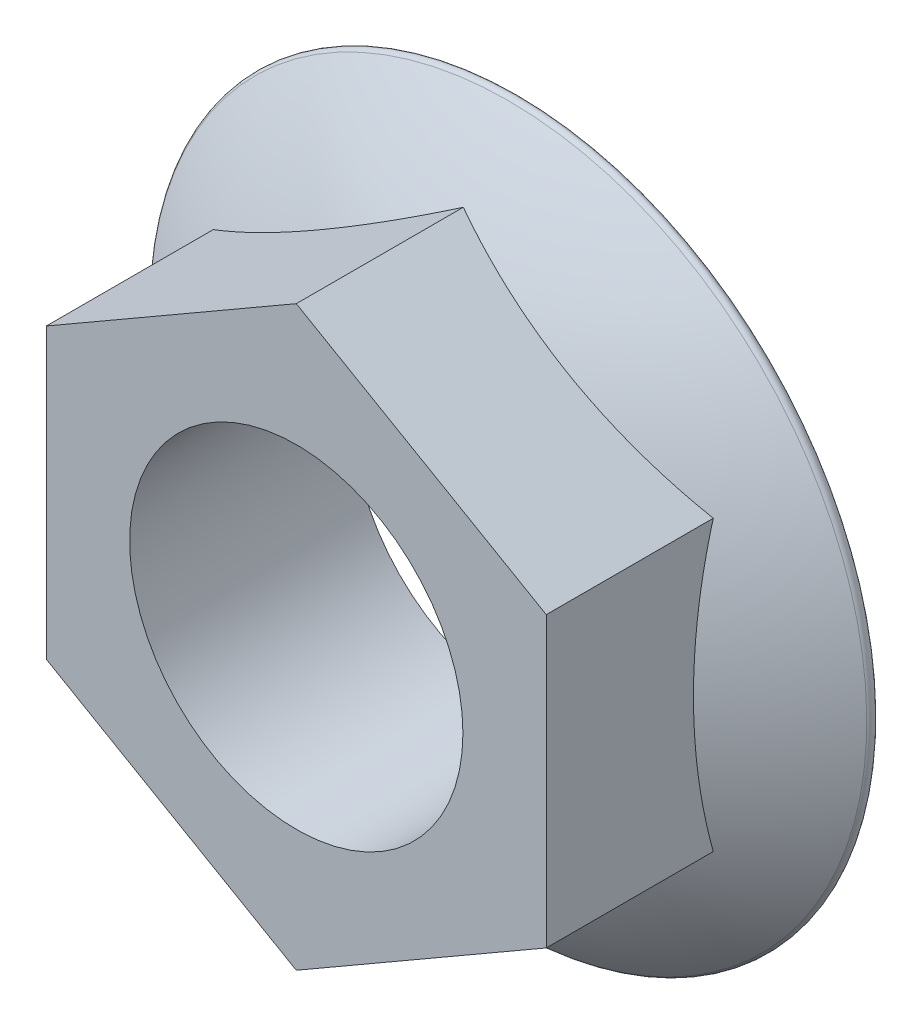
ISO-10303-21;
HEADER;
FILE_DESCRIPTION(('STEP AP214'),'2;1');
FILE_NAME('part.step','',(''),(''),'','','');
FILE_SCHEMA(('AUTOMOTIVE_DESIGN { 1 0 10303 214 1 1 1 1 }'));
ENDSEC;
DATA;
#1=APPLICATION_CONTEXT('core data for automotive mechanical design processes');
#2=APPLICATION_PROTOCOL_DEFINITION('international standard','automotive_design',2000,#1);
#3=PRODUCT_CONTEXT('',#1,'mechanical');
#4=PRODUCT('Part','Part','',(#3));
#5=PRODUCT_RELATED_PRODUCT_CATEGORY('part','',(#4));
#6=PRODUCT_DEFINITION_FORMATION('','',#4);
#7=PRODUCT_DEFINITION_CONTEXT('part definition',#1,'design');
#8=PRODUCT_DEFINITION('design','',#6,#7);
#9=PRODUCT_DEFINITION_SHAPE('','',#8);
#10=(LENGTH_UNIT() NAMED_UNIT(*) SI_UNIT(.MILLI.,.METRE.));
#11=(NAMED_UNIT(*) PLANE_ANGLE_UNIT() SI_UNIT($,.RADIAN.));
#12=(NAMED_UNIT(*) SI_UNIT($,.STERADIAN.) SOLID_ANGLE_UNIT());
#13=UNCERTAINTY_MEASURE_WITH_UNIT(LENGTH_MEASURE(1.E-05),#10,'distance_accuracy_value','');
#14=(GEOMETRIC_REPRESENTATION_CONTEXT(3) GLOBAL_UNCERTAINTY_ASSIGNED_CONTEXT((#13)) GLOBAL_UNIT_ASSIGNED_CONTEXT((#10,
#11,#12)) REPRESENTATION_CONTEXT('',''));
#15=CARTESIAN_POINT('',(0.,0.,0.));
#16=DIRECTION('',(0.,0.,1.));
#17=DIRECTION('',(1.,0.,0.));
#18=AXIS2_PLACEMENT_3D('',#15,#16,#17);
#19=CARTESIAN_POINT('',(22.5,-12.9903810567666,20.));
#20=DIRECTION('',(-1.,0.,0.));
#21=DIRECTION('',(0.,-1.,0.));
#22=AXIS2_PLACEMENT_3D('',#19,#20,#21);
#23=PLANE('',#22);
#24=CARTESIAN_POINT('',(22.5,41.2430986732343,-15.6292807485795));
#25=CARTESIAN_POINT('',(22.5,40.8770373115232,-15.0780653137109));
#26=CARTESIAN_POINT('',(22.5,40.5002041181613,-14.53408635413));
#27=CARTESIAN_POINT('',(22.5,39.7254949438743,-13.4613257294143));
#28=CARTESIAN_POINT('',(22.5,39.3276189836814,-12.9325440493072));
#29=CARTESIAN_POINT('',(22.5,38.1033867119656,-11.3703472465446));
#30=CARTESIAN_POINT('',(22.5,37.2462375401342,-10.3607966012798));
#31=CARTESIAN_POINT('',(22.5,35.4549842756172,-8.41176356607677));
#32=CARTESIAN_POINT('',(22.5,34.5208441859798,-7.47231434753338));
#33=CARTESIAN_POINT('',(22.5,32.581492554901,-5.66976232726574));
#34=CARTESIAN_POINT('',(22.5,31.5762778123882,-4.80666296814435));
#35=CARTESIAN_POINT('',(22.5,29.4254615141008,-3.10264021829861));
#36=CARTESIAN_POINT('',(22.5,28.2749664002998,-2.26788331560803));
#37=CARTESIAN_POINT('',(22.5,25.9072519211025,-0.698933093659436));
#38=CARTESIAN_POINT('',(22.5,24.690028676339,0.0352543701024379));
#39=CARTESIAN_POINT('',(22.5,22.1976640004486,1.39715764361353));
#40=CARTESIAN_POINT('',(22.5,20.9225328319565,2.02489222666235));
#41=CARTESIAN_POINT('',(22.5,18.3231922841706,3.16882344821283));
#42=CARTESIAN_POINT('',(22.5,16.9989840495905,3.68502268634081));
#43=CARTESIAN_POINT('',(22.5,14.3255227439116,4.59626301955649));
#44=CARTESIAN_POINT('',(22.5,12.9766968725397,4.99255704134787));
#45=CARTESIAN_POINT('',(22.5,10.2499009160885,5.66751853568315));
#46=CARTESIAN_POINT('',(22.5,8.87193104308593,5.94618686386322));
#47=CARTESIAN_POINT('',(22.5,6.09719954449552,6.382673798637));
#48=CARTESIAN_POINT('',(22.5,4.70044120058571,6.54051323785899));
#49=CARTESIAN_POINT('',(22.5,1.89848626503339,6.73336681075521));
#50=CARTESIAN_POINT('',(22.5,0.493289942867293,6.7683848461922));
#51=CARTESIAN_POINT('',(22.5,-2.27436160623006,6.71589310157562));
#52=CARTESIAN_POINT('',(22.5,-3.63688447873942,6.63187603267871));
#53=CARTESIAN_POINT('',(22.5,-6.3498793255035,6.34862368332526));
#54=CARTESIAN_POINT('',(22.5,-7.70035139939226,6.14938935636415));
#55=CARTESIAN_POINT('',(22.5,-10.3797730586753,5.63802321657721));
#56=CARTESIAN_POINT('',(22.5,-11.7087217728043,5.32588684535292));
#57=CARTESIAN_POINT('',(22.5,-14.3359537340933,4.59191578703687));
#58=CARTESIAN_POINT('',(22.5,-15.6342367730643,4.17008035543215));
#59=CARTESIAN_POINT('',(22.5,-18.192934164009,3.21995942831946));
#60=CARTESIAN_POINT('',(22.5,-19.4533029666856,2.69155134179365));
#61=CARTESIAN_POINT('',(22.5,-21.9263167238574,1.53287499043955));
#62=CARTESIAN_POINT('',(22.5,-23.1389610729566,0.902605433992208));
#63=CARTESIAN_POINT('',(22.5,-25.5087144799012,-0.455098885527981));
#64=CARTESIAN_POINT('',(22.5,-26.6658180360688,-1.18254324751003));
#65=CARTESIAN_POINT('',(22.5,-28.9168182333567,-2.72930924681635));
#66=CARTESIAN_POINT('',(22.5,-30.0107182541453,-3.54862596456852));
#67=CARTESIAN_POINT('',(22.5,-32.0519152911591,-5.21124994583442));
#68=CARTESIAN_POINT('',(22.5,-33.0040960821671,-6.04857140248971));
#69=CARTESIAN_POINT('',(22.5,-34.8426605428461,-7.79247249824401));
#70=CARTESIAN_POINT('',(22.5,-35.7290472830522,-8.69904890127989));
#71=CARTESIAN_POINT('',(22.5,-37.4308912703298,-10.5760097790314));
#72=CARTESIAN_POINT('',(22.5,-38.2463760806418,-11.5463691980479));
#73=CARTESIAN_POINT('',(22.5,-39.4131314622153,-13.0455824878557));
#74=CARTESIAN_POINT('',(22.5,-39.7926798675837,-13.552662389869));
#75=CARTESIAN_POINT('',(22.5,-40.5324750850266,-14.5807126419942));
#76=CARTESIAN_POINT('',(22.5,-40.8927218795493,-15.1016830047367));
#77=CARTESIAN_POINT('',(22.5,-41.2430986732343,-15.6292807485795));
#78=B_SPLINE_CURVE_WITH_KNOTS('',3,(#24,#25,#26,#27,#28,#29,#30,#31,#32,#33,#34,#35,#36,#37,#38,
#39,#40,#41,#42,#43,#44,#45,#46,#47,#48,#49,#50,#51,#52,#53,#54,#55,#56,#57,#58,#59,#60,#61,#62,
#63,#64,#65,#66,#67,#68,#69,#70,#71,#72,#73,#74,#75,#76,#77),.UNSPECIFIED.,.F.,.F.,(4,2,2,2,2,2,
2,2,2,2,2,2,2,2,2,2,2,2,2,2,2,2,2,2,2,2,4),(0.,1.98481748302872,3.96963301055293,
7.93824497031326,11.9087230888573,15.8793801444628,20.1385039848108,24.3978757005833,
28.6564954798757,32.915015990057,37.1273652799798,41.3396839277834,45.5512761479419,
49.7627345739735,53.8531491778947,57.9435299315413,62.0340758519666,66.1246495351086,
70.2199557398818,74.3153138778407,78.4110768540678,82.5066206154109,86.3069637304803,
90.1071293761089,93.9058110333071,95.8056052846931,97.7054012636237),.UNSPECIFIED.);
#79=CARTESIAN_POINT('',(22.5,12.9903810567666,4.96781744260645));
#80=VERTEX_POINT('',#79);
#81=CARTESIAN_POINT('',(22.5,-12.9903810567666,4.96781744261134));
#82=VERTEX_POINT('',#81);
#83=EDGE_CURVE('E60',#80,#82,#78,.T.);
#84=ORIENTED_EDGE('',*,*,#83,.F.);
#85=DIRECTION('',(0.,0.,-1.));
#86=VECTOR('',#85,1.);
#87=CARTESIAN_POINT('',(22.5,12.9903810567666,20.));
#88=LINE('',#87,#86);
#89=CARTESIAN_POINT('',(22.5,12.9903810567666,20.));
#90=VERTEX_POINT('',#89);
#91=EDGE_CURVE('E53',#90,#80,#88,.T.);
#92=ORIENTED_EDGE('',*,*,#91,.F.);
#93=DIRECTION('',(0.,1.,0.));
#94=VECTOR('',#93,1.);
#95=CARTESIAN_POINT('',(22.5,-12.9903810567666,20.));
#96=LINE('',#95,#94);
#97=CARTESIAN_POINT('',(22.5,-12.9903810567666,20.));
#98=VERTEX_POINT('',#97);
#99=EDGE_CURVE('E123',#98,#90,#96,.T.);
#100=ORIENTED_EDGE('',*,*,#99,.F.);
#101=DIRECTION('',(0.,0.,-1.));
#102=VECTOR('',#101,1.);
#103=CARTESIAN_POINT('',(22.5,-12.9903810567666,20.));
#104=LINE('',#103,#102);
#105=EDGE_CURVE('E109',#98,#82,#104,.T.);
#106=ORIENTED_EDGE('',*,*,#105,.T.);
#107=EDGE_LOOP('',(#84,#92,#100,#106));
#108=FACE_BOUND('',#107,.T.);
#109=ADVANCED_FACE('F39',(#108),#23,.F.);
#110=CARTESIAN_POINT('',(22.5,12.9903810567666,20.));
#111=DIRECTION('',(-0.5,-0.866025403784439,0.));
#112=DIRECTION('',(0.866025403784439,-0.5,0.));
#113=AXIS2_PLACEMENT_3D('',#110,#111,#112);
#114=PLANE('',#113);
#115=CARTESIAN_POINT('',(-0.000200000000004346,25.980877583587,4.9677530924356));
#116=CARTESIAN_POINT('',(0.49345985903424,25.6958629310855,5.12658893374724));
#117=CARTESIAN_POINT('',(0.989566647265567,25.4094355433533,5.2750889432327));
#118=CARTESIAN_POINT('',(1.9861340898107,24.8340670621342,5.55117580547707));
#119=CARTESIAN_POINT('',(2.48659481872272,24.5451259255781,5.67876229916838));
#120=CARTESIAN_POINT('',(3.99361291127382,23.67504862417,6.02976775939959));
#121=CARTESIAN_POINT('',(5.00586470631058,23.0906247778179,6.22145155162274));
#122=CARTESIAN_POINT('',(7.01992814623338,21.9278047086135,6.51552338723384));
#123=CARTESIAN_POINT('',(8.0215596198414,21.3495125076971,6.61957655196648));
#124=CARTESIAN_POINT('',(10.028641150501,20.1907234456853,6.74368827408737));
#125=CARTESIAN_POINT('',(11.03409066589,19.6102268973188,6.76375833097676));
#126=CARTESIAN_POINT('',(12.914582096951,18.5245246633869,6.72257354051225));
#127=CARTESIAN_POINT('',(13.7898028755015,18.0192157112905,6.67142340475237));
#128=CARTESIAN_POINT('',(15.5357121578081,17.0112145171701,6.50556680775638));
#129=CARTESIAN_POINT('',(16.4064007635766,16.5085222162493,6.39086178334382));
#130=CARTESIAN_POINT('',(18.1548220379868,15.4990707228117,6.09611754326881));
#131=CARTESIAN_POINT('',(19.0324160189791,14.9923916016466,5.91498247841007));
#132=CARTESIAN_POINT('',(20.7759321421359,13.9857720986056,5.48891514666777));
#133=CARTESIAN_POINT('',(21.6418540587257,13.4858318469653,5.243981648668));
#134=CARTESIAN_POINT('',(22.5002,12.9902655867127,4.96775309243561));
#135=B_SPLINE_CURVE_WITH_KNOTS('',3,(#115,#116,#117,#118,#119,#120,#121,#122,#123,#124,#125,
#126,#127,#128,#129,#130,#131,#132,#133,#134),.UNSPECIFIED.,.F.,.F.,(4,2,2,2,2,2,2,2,2,4),(0.,
1.7750314203024,3.55009331322076,7.10000712785814,10.5808389640228,14.0611941669607,
17.0949696590675,20.1286765675878,23.2148615509504,26.3011060927326),.UNSPECIFIED.);
#136=CARTESIAN_POINT('',(0.,25.9807621135332,4.96781744260644));
#137=VERTEX_POINT('',#136);
#138=EDGE_CURVE('E67',#137,#80,#135,.T.);
#139=ORIENTED_EDGE('',*,*,#138,.F.);
#140=DIRECTION('',(0.,0.,-1.));
#141=VECTOR('',#140,1.);
#142=CARTESIAN_POINT('',(0.,25.9807621135332,20.));
#143=LINE('',#142,#141);
#144=CARTESIAN_POINT('',(0.,25.9807621135332,20.));
#145=VERTEX_POINT('',#144);
#146=EDGE_CURVE('E286',#145,#137,#143,.T.);
#147=ORIENTED_EDGE('',*,*,#146,.F.);
#148=DIRECTION('',(-0.866025403784439,0.5,0.));
#149=VECTOR('',#148,1.);
#150=CARTESIAN_POINT('',(22.5,12.9903810567666,20.));
#151=LINE('',#150,#149);
#152=EDGE_CURVE('E126',#90,#145,#151,.T.);
#153=ORIENTED_EDGE('',*,*,#152,.F.);
#154=ORIENTED_EDGE('',*,*,#91,.T.);
#155=EDGE_LOOP('',(#139,#147,#153,#154));
#156=FACE_BOUND('',#155,.T.);
#157=ADVANCED_FACE('F175',(#156),#114,.F.);
#158=CARTESIAN_POINT('',(0.,25.9807621135332,20.));
#159=DIRECTION('',(0.5,-0.866025403784439,0.));
#160=DIRECTION('',(0.866025403784439,0.5,0.));
#161=AXIS2_PLACEMENT_3D('',#158,#159,#160);
#162=PLANE('',#161);
#163=CARTESIAN_POINT('',(-22.5002,12.9902655867127,4.96775309243559));
#164=CARTESIAN_POINT('',(-22.0065401409658,13.2752802392143,5.12658893374723));
#165=CARTESIAN_POINT('',(-21.5104333527344,13.5617076269464,5.27508894323269));
#166=CARTESIAN_POINT('',(-20.5138659101893,14.1370761081655,5.55117580547706));
#167=CARTESIAN_POINT('',(-20.0134051812773,14.4260172447217,5.67876229916837));
#168=CARTESIAN_POINT('',(-18.5063870887262,15.2960945461297,6.02976775939959));
#169=CARTESIAN_POINT('',(-17.4941352936894,15.8805183924818,6.22145155162274));
#170=CARTESIAN_POINT('',(-15.4800718537666,17.0433384616863,6.51552338723384));
#171=CARTESIAN_POINT('',(-14.4784403801586,17.6216306626026,6.61957655196647));
#172=CARTESIAN_POINT('',(-12.471358849499,18.7804197246145,6.74368827408736));
#173=CARTESIAN_POINT('',(-11.46590933411,19.3609162729809,6.76375833097675));
#174=CARTESIAN_POINT('',(-9.58541790304896,20.4466185069128,6.72257354051224));
#175=CARTESIAN_POINT('',(-8.71019712449852,20.9519274590092,6.67142340475236));
#176=CARTESIAN_POINT('',(-6.96428784219194,21.9599286531296,6.50556680775637));
#177=CARTESIAN_POINT('',(-6.09359923642341,22.4626209540504,6.39086178334381));
#178=CARTESIAN_POINT('',(-4.3451779620132,23.472072447488,6.09611754326881));
#179=CARTESIAN_POINT('',(-3.46758398102087,23.9787515686531,5.91498247841007));
#180=CARTESIAN_POINT('',(-1.72406785786413,24.9853710716941,5.48891514666777));
#181=CARTESIAN_POINT('',(-0.858145941274325,25.4853113233344,5.243981648668));
#182=CARTESIAN_POINT('',(0.000199999999995002,25.980877583587,4.9677530924356));
#183=B_SPLINE_CURVE_WITH_KNOTS('',3,(#163,#164,#165,#166,#167,#168,#169,#170,#171,#172,#173,
#174,#175,#176,#177,#178,#179,#180,#181,#182),.UNSPECIFIED.,.F.,.F.,(4,2,2,2,2,2,2,2,2,4),(0.,
1.7750314203024,3.55009331322076,7.10000712785814,10.5808389640228,14.0611941669607,
17.0949696590675,20.1286765675878,23.2148615509504,26.3011060927326),.UNSPECIFIED.);
#184=CARTESIAN_POINT('',(-22.5,12.9903810567666,4.96781744260642));
#185=VERTEX_POINT('',#184);
#186=EDGE_CURVE('E128',#185,#137,#183,.T.);
#187=ORIENTED_EDGE('',*,*,#186,.F.);
#188=DIRECTION('',(0.,0.,-1.));
#189=VECTOR('',#188,1.);
#190=CARTESIAN_POINT('',(-22.5,12.9903810567666,20.));
#191=LINE('',#190,#189);
#192=CARTESIAN_POINT('',(-22.5,12.9903810567666,20.));
#193=VERTEX_POINT('',#192);
#194=EDGE_CURVE('E287',#193,#185,#191,.T.);
#195=ORIENTED_EDGE('',*,*,#194,.F.);
#196=DIRECTION('',(-0.866025403784439,-0.5,0.));
#197=VECTOR('',#196,1.);
#198=CARTESIAN_POINT('',(0.,25.9807621135332,20.));
#199=LINE('',#198,#197);
#200=EDGE_CURVE('E299',#145,#193,#199,.T.);
#201=ORIENTED_EDGE('',*,*,#200,.F.);
#202=ORIENTED_EDGE('',*,*,#146,.T.);
#203=EDGE_LOOP('',(#187,#195,#201,#202));
#204=FACE_BOUND('',#203,.T.);
#205=ADVANCED_FACE('F171',(#204),#162,.F.);
#206=CARTESIAN_POINT('',(-22.5,12.9903810567666,20.));
#207=DIRECTION('',(1.,0.,0.));
#208=DIRECTION('',(0.,1.,0.));
#209=AXIS2_PLACEMENT_3D('',#206,#207,#208);
#210=PLANE('',#209);
#211=CARTESIAN_POINT('',(-22.5,-41.2430986732343,-15.6292807485795));
#212=CARTESIAN_POINT('',(-22.5,-40.8770373115232,-15.0780653137109));
#213=CARTESIAN_POINT('',(-22.5,-40.5002041181613,-14.5340863541301));
#214=CARTESIAN_POINT('',(-22.5,-39.7254949438743,-13.4613257294144));
#215=CARTESIAN_POINT('',(-22.5,-39.3276189836815,-12.9325440493072));
#216=CARTESIAN_POINT('',(-22.5,-38.1033867119656,-11.3703472465447));
#217=CARTESIAN_POINT('',(-22.5,-37.2462375401342,-10.3607966012798));
#218=CARTESIAN_POINT('',(-22.5,-35.4549842756172,-8.41176356607679));
#219=CARTESIAN_POINT('',(-22.5,-34.5208441859799,-7.4723143475334));
#220=CARTESIAN_POINT('',(-22.5,-32.581492554901,-5.66976232726576));
#221=CARTESIAN_POINT('',(-22.5,-31.5762778123882,-4.80666296814437));
#222=CARTESIAN_POINT('',(-22.5,-29.4254615141008,-3.10264021829863));
#223=CARTESIAN_POINT('',(-22.5,-28.2749664002998,-2.26788331560805));
#224=CARTESIAN_POINT('',(-22.5,-25.9072519211025,-0.698933093659455));
#225=CARTESIAN_POINT('',(-22.5,-24.690028676339,0.035254370102427));
#226=CARTESIAN_POINT('',(-22.5,-22.1976640004486,1.39715764361352));
#227=CARTESIAN_POINT('',(-22.5,-20.9225328319565,2.02489222666233));
#228=CARTESIAN_POINT('',(-22.5,-18.3231922841706,3.16882344821281));
#229=CARTESIAN_POINT('',(-22.5,-16.9989840495905,3.68502268634079));
#230=CARTESIAN_POINT('',(-22.5,-14.3255227439116,4.59626301955647));
#231=CARTESIAN_POINT('',(-22.5,-12.9766968725397,4.99255704134785));
#232=CARTESIAN_POINT('',(-22.5,-10.2499009160886,5.66751853568313));
#233=CARTESIAN_POINT('',(-22.5,-8.87193104308595,5.94618686386321));
#234=CARTESIAN_POINT('',(-22.5,-6.09719954449554,6.382673798637));
#235=CARTESIAN_POINT('',(-22.5,-4.70044120058573,6.54051323785898));
#236=CARTESIAN_POINT('',(-22.5,-1.89848626503341,6.73336681075521));
#237=CARTESIAN_POINT('',(-22.5,-0.493289942867309,6.76838484619219));
#238=CARTESIAN_POINT('',(-22.5,2.27436160623004,6.71589310157561));
#239=CARTESIAN_POINT('',(-22.5,3.6368844787394,6.63187603267871));
#240=CARTESIAN_POINT('',(-22.5,6.34987932550348,6.34862368332527));
#241=CARTESIAN_POINT('',(-22.5,7.70035139939224,6.14938935636415));
#242=CARTESIAN_POINT('',(-22.5,10.3797730586753,5.6380232165772));
#243=CARTESIAN_POINT('',(-22.5,11.7087217728043,5.32588684535291));
#244=CARTESIAN_POINT('',(-22.5,14.3359537340933,4.59191578703687));
#245=CARTESIAN_POINT('',(-22.5,15.6342367730643,4.17008035543216));
#246=CARTESIAN_POINT('',(-22.5,18.192934164009,3.21995942831947));
#247=CARTESIAN_POINT('',(-22.5,19.4533029666856,2.69155134179365));
#248=CARTESIAN_POINT('',(-22.5,21.9263167238574,1.53287499043955));
#249=CARTESIAN_POINT('',(-22.5,23.1389610729566,0.902605433992206));
#250=CARTESIAN_POINT('',(-22.5,25.5087144799012,-0.455098885527981));
#251=CARTESIAN_POINT('',(-22.5,26.6658180360688,-1.18254324751003));
#252=CARTESIAN_POINT('',(-22.5,28.9168182333567,-2.72930924681635));
#253=CARTESIAN_POINT('',(-22.5,30.0107182541453,-3.5486259645685));
#254=CARTESIAN_POINT('',(-22.5,32.0519152911591,-5.21124994583441));
#255=CARTESIAN_POINT('',(-22.5,33.0040960821671,-6.04857140248969));
#256=CARTESIAN_POINT('',(-22.5,34.8426605428461,-7.792472498244));
#257=CARTESIAN_POINT('',(-22.5,35.7290472830522,-8.69904890127989));
#258=CARTESIAN_POINT('',(-22.5,37.4308912703298,-10.5760097790314));
#259=CARTESIAN_POINT('',(-22.5,38.2463760806418,-11.5463691980479));
#260=CARTESIAN_POINT('',(-22.5,39.4131314622153,-13.0455824878557));
#261=CARTESIAN_POINT('',(-22.5,39.7926798675837,-13.552662389869));
#262=CARTESIAN_POINT('',(-22.5,40.5324750850266,-14.5807126419941));
#263=CARTESIAN_POINT('',(-22.5,40.8927218795492,-15.1016830047367));
#264=CARTESIAN_POINT('',(-22.5,41.2430986732343,-15.6292807485795));
#265=B_SPLINE_CURVE_WITH_KNOTS('',3,(#211,#212,#213,#214,#215,#216,#217,#218,#219,#220,#221,
#222,#223,#224,#225,#226,#227,#228,#229,#230,#231,#232,#233,#234,#235,#236,#237,#238,#239,#240,
#241,#242,#243,#244,#245,#246,#247,#248,#249,#250,#251,#252,#253,#254,#255,#256,#257,#258,#259,
#260,#261,#262,#263,#264),.UNSPECIFIED.,.F.,.F.,(4,2,2,2,2,2,2,2,2,2,2,2,2,2,2,2,2,2,2,2,2,2,2,
2,2,2,4),(0.,1.98481748302873,3.96963301055294,7.93824497031328,11.9087230888574,
15.8793801444628,20.1385039848108,24.3978757005833,28.6564954798757,32.915015990057,
37.1273652799799,41.3396839277835,45.5512761479419,49.7627345739735,53.8531491778947,
57.9435299315413,62.0340758519667,66.1246495351086,70.2199557398819,74.3153138778408,
78.4110768540679,82.5066206154109,86.3069637304803,90.1071293761089,93.9058110333072,
95.8056052846931,97.7054012636238),.UNSPECIFIED.);
#266=CARTESIAN_POINT('',(-22.5,-12.9903810567666,4.96781744260643));
#267=VERTEX_POINT('',#266);
#268=EDGE_CURVE('E118',#267,#185,#265,.T.);
#269=ORIENTED_EDGE('',*,*,#268,.F.);
#270=DIRECTION('',(0.,0.,-1.));
#271=VECTOR('',#270,1.);
#272=CARTESIAN_POINT('',(-22.5,-12.9903810567666,20.));
#273=LINE('',#272,#271);
#274=CARTESIAN_POINT('',(-22.5,-12.9903810567666,20.));
#275=VERTEX_POINT('',#274);
#276=EDGE_CURVE('E108',#275,#267,#273,.T.);
#277=ORIENTED_EDGE('',*,*,#276,.F.);
#278=DIRECTION('',(0.,-1.,0.));
#279=VECTOR('',#278,1.);
#280=CARTESIAN_POINT('',(-22.5,12.9903810567666,20.));
#281=LINE('',#280,#279);
#282=EDGE_CURVE('E297',#193,#275,#281,.T.);
#283=ORIENTED_EDGE('',*,*,#282,.F.);
#284=ORIENTED_EDGE('',*,*,#194,.T.);
#285=EDGE_LOOP('',(#269,#277,#283,#284));
#286=FACE_BOUND('',#285,.T.);
#287=ADVANCED_FACE('F174',(#286),#210,.F.);
#288=CARTESIAN_POINT('',(-22.5,-12.9903810567666,20.));
#289=DIRECTION('',(0.5,0.866025403784439,0.));
#290=DIRECTION('',(-0.866025403784439,0.5,0.));
#291=AXIS2_PLACEMENT_3D('',#288,#289,#290);
#292=PLANE('',#291);
#293=CARTESIAN_POINT('',(0.00019999999998986,-25.980877583587,4.96775309243559));
#294=CARTESIAN_POINT('',(-0.493459859034253,-25.6958629310855,5.12658893374725));
#295=CARTESIAN_POINT('',(-0.989566647265581,-25.4094355433533,5.27508894323271));
#296=CARTESIAN_POINT('',(-1.98613408981072,-24.8340670621343,5.55117580547707));
#297=CARTESIAN_POINT('',(-2.48659481872273,-24.5451259255781,5.67876229916837));
#298=CARTESIAN_POINT('',(-3.99361291127384,-23.67504862417,6.02976775939958));
#299=CARTESIAN_POINT('',(-5.0058647063106,-23.0906247778179,6.22145155162274));
#300=CARTESIAN_POINT('',(-7.0199281462334,-21.9278047086135,6.51552338723384));
#301=CARTESIAN_POINT('',(-8.02155961984142,-21.3495125076971,6.61957655196647));
#302=CARTESIAN_POINT('',(-10.028641150501,-20.1907234456853,6.74368827408736));
#303=CARTESIAN_POINT('',(-11.03409066589,-19.6102268973188,6.76375833097675));
#304=CARTESIAN_POINT('',(-12.9145820969511,-18.5245246633869,6.72257354051224));
#305=CARTESIAN_POINT('',(-13.7898028755015,-18.0192157112905,6.67142340475236));
#306=CARTESIAN_POINT('',(-15.5357121578081,-17.0112145171701,6.50556680775637));
#307=CARTESIAN_POINT('',(-16.4064007635766,-16.5085222162493,6.39086178334381));
#308=CARTESIAN_POINT('',(-18.1548220379868,-15.4990707228117,6.0961175432688));
#309=CARTESIAN_POINT('',(-19.0324160189791,-14.9923916016466,5.91498247841006));
#310=CARTESIAN_POINT('',(-20.7759321421359,-13.9857720986056,5.48891514666776));
#311=CARTESIAN_POINT('',(-21.6418540587257,-13.4858318469653,5.24398164866799));
#312=CARTESIAN_POINT('',(-22.5002,-12.9902655867127,4.9677530924356));
#313=B_SPLINE_CURVE_WITH_KNOTS('',3,(#293,#294,#295,#296,#297,#298,#299,#300,#301,#302,#303,
#304,#305,#306,#307,#308,#309,#310,#311,#312),.UNSPECIFIED.,.F.,.F.,(4,2,2,2,2,2,2,2,2,4),(0.,
1.7750314203024,3.55009331322076,7.10000712785814,10.5808389640228,14.0611941669608,
17.0949696590675,20.1286765675878,23.2148615509504,26.3011060927326),.UNSPECIFIED.);
#314=CARTESIAN_POINT('',(0.,-25.9807621135332,4.96781744260643));
#315=VERTEX_POINT('',#314);
#316=EDGE_CURVE('E113',#315,#267,#313,.T.);
#317=ORIENTED_EDGE('',*,*,#316,.F.);
#318=DIRECTION('',(0.,0.,-1.));
#319=VECTOR('',#318,1.);
#320=CARTESIAN_POINT('',(0.,-25.9807621135332,20.));
#321=LINE('',#320,#319);
#322=CARTESIAN_POINT('',(0.,-25.9807621135332,20.));
#323=VERTEX_POINT('',#322);
#324=EDGE_CURVE('E101',#323,#315,#321,.T.);
#325=ORIENTED_EDGE('',*,*,#324,.F.);
#326=DIRECTION('',(0.866025403784439,-0.5,0.));
#327=VECTOR('',#326,1.);
#328=CARTESIAN_POINT('',(-22.5,-12.9903810567666,20.));
#329=LINE('',#328,#327);
#330=EDGE_CURVE('E295',#275,#323,#329,.T.);
#331=ORIENTED_EDGE('',*,*,#330,.F.);
#332=ORIENTED_EDGE('',*,*,#276,.T.);
#333=EDGE_LOOP('',(#317,#325,#331,#332));
#334=FACE_BOUND('',#333,.T.);
#335=ADVANCED_FACE('F114',(#334),#292,.F.);
#336=CARTESIAN_POINT('',(0.,-25.9807621135332,20.));
#337=DIRECTION('',(-0.5,0.866025403784439,0.));
#338=DIRECTION('',(-0.866025403784439,-0.5,0.));
#339=AXIS2_PLACEMENT_3D('',#336,#337,#338);
#340=PLANE('',#339);
#341=CARTESIAN_POINT('',(22.5002,-12.9902655867127,4.96775309243559));
#342=CARTESIAN_POINT('',(22.0065401409658,-13.2752802392143,5.12658893374725));
#343=CARTESIAN_POINT('',(21.5104333527344,-13.5617076269464,5.27508894323271));
#344=CARTESIAN_POINT('',(20.5138659101893,-14.1370761081655,5.55117580547707));
#345=CARTESIAN_POINT('',(20.0134051812773,-14.4260172447217,5.67876229916837));
#346=CARTESIAN_POINT('',(18.5063870887262,-15.2960945461297,6.02976775939958));
#347=CARTESIAN_POINT('',(17.4941352936894,-15.8805183924818,6.22145155162274));
#348=CARTESIAN_POINT('',(15.4800718537666,-17.0433384616863,6.51552338723384));
#349=CARTESIAN_POINT('',(14.4784403801586,-17.6216306626026,6.61957655196647));
#350=CARTESIAN_POINT('',(12.471358849499,-18.7804197246145,6.74368827408736));
#351=CARTESIAN_POINT('',(11.46590933411,-19.3609162729809,6.76375833097675));
#352=CARTESIAN_POINT('',(9.58541790304895,-20.4466185069128,6.72257354051225));
#353=CARTESIAN_POINT('',(8.71019712449851,-20.9519274590092,6.67142340475236));
#354=CARTESIAN_POINT('',(6.96428784219193,-21.9599286531296,6.50556680775637));
#355=CARTESIAN_POINT('',(6.09359923642341,-22.4626209540504,6.39086178334381));
#356=CARTESIAN_POINT('',(4.34517796201319,-23.472072447488,6.0961175432688));
#357=CARTESIAN_POINT('',(3.46758398102087,-23.9787515686531,5.91498247841006));
#358=CARTESIAN_POINT('',(1.72406785786412,-24.9853710716941,5.48891514666776));
#359=CARTESIAN_POINT('',(0.858145941274314,-25.4853113233344,5.243981648668));
#360=CARTESIAN_POINT('',(-0.000200000000011237,-25.980877583587,4.9677530924356));
#361=B_SPLINE_CURVE_WITH_KNOTS('',3,(#341,#342,#343,#344,#345,#346,#347,#348,#349,#350,#351,
#352,#353,#354,#355,#356,#357,#358,#359,#360),.UNSPECIFIED.,.F.,.F.,(4,2,2,2,2,2,2,2,2,4),(0.,
1.7750314203024,3.55009331322077,7.10000712785814,10.5808389640228,14.0611941669607,
17.0949696590675,20.1286765675878,23.2148615509504,26.3011060927326),.UNSPECIFIED.);
#362=EDGE_CURVE('E11',#82,#315,#361,.T.);
#363=ORIENTED_EDGE('',*,*,#362,.F.);
#364=ORIENTED_EDGE('',*,*,#105,.F.);
#365=DIRECTION('',(0.866025403784439,0.5,0.));
#366=VECTOR('',#365,1.);
#367=CARTESIAN_POINT('',(0.,-25.9807621135332,20.));
#368=LINE('',#367,#366);
#369=EDGE_CURVE('E105',#323,#98,#368,.T.);
#370=ORIENTED_EDGE('',*,*,#369,.F.);
#371=ORIENTED_EDGE('',*,*,#324,.T.);
#372=EDGE_LOOP('',(#363,#364,#370,#371));
#373=FACE_BOUND('',#372,.T.);
#374=ADVANCED_FACE('F103',(#373),#340,.F.);
#375=CARTESIAN_POINT('',(0.,0.,20.));
#376=DIRECTION('',(0.,0.,1.));
#377=DIRECTION('',(1.,0.,0.));
#378=AXIS2_PLACEMENT_3D('',#375,#376,#377);
#379=PLANE('',#378);
#380=CARTESIAN_POINT('',(0.,0.,20.));
#381=DIRECTION('',(0.,0.,1.));
#382=DIRECTION('',(1.,0.,0.));
#383=AXIS2_PLACEMENT_3D('',#380,#381,#382);
#384=CIRCLE('',#383,15.);
#385=CARTESIAN_POINT('',(15.,0.,20.));
#386=VERTEX_POINT('',#385);
#387=EDGE_CURVE('E273',#386,#386,#384,.T.);
#388=ORIENTED_EDGE('',*,*,#387,.F.);
#389=EDGE_LOOP('',(#388));
#390=FACE_BOUND('',#389,.T.);
#391=ORIENTED_EDGE('',*,*,#99,.T.);
#392=ORIENTED_EDGE('',*,*,#152,.T.);
#393=ORIENTED_EDGE('',*,*,#200,.T.);
#394=ORIENTED_EDGE('',*,*,#282,.T.);
#395=ORIENTED_EDGE('',*,*,#330,.T.);
#396=ORIENTED_EDGE('',*,*,#369,.T.);
#397=EDGE_LOOP('',(#391,#392,#393,#394,#395,#396));
#398=FACE_BOUND('',#397,.T.);
#399=ADVANCED_FACE('F145',(#390,#398),#379,.T.);
#400=CARTESIAN_POINT('',(0.,0.,-43.676150387135));
#401=DIRECTION('',(0.,0.,-1.));
#402=DIRECTION('',(0.,1.,0.));
#403=AXIS2_PLACEMENT_3D('',#400,#401,#402);
#404=DEGENERATE_TOROIDAL_SURFACE('',#403,1.1277212626382,55.6875702215232,.F.);
#405=CARTESIAN_POINT('',(0.,0.,0.900236413832048));
#406=DIRECTION('',(0.,0.,-1.));
#407=DIRECTION('',(0.,1.,0.));
#408=AXIS2_PLACEMENT_3D('',#405,#406,#407);
#409=CIRCLE('',#408,32.249684522528);
#410=CARTESIAN_POINT('',(0.,32.249684522528,0.900236413832052));
#411=VERTEX_POINT('',#410);
#412=EDGE_CURVE('E275',#411,#411,#409,.T.);
#413=ORIENTED_EDGE('',*,*,#412,.F.);
#414=EDGE_LOOP('',(#413));
#415=FACE_BOUND('',#414,.T.);
#416=ORIENTED_EDGE('',*,*,#138,.T.);
#417=ORIENTED_EDGE('',*,*,#83,.T.);
#418=ORIENTED_EDGE('',*,*,#362,.T.);
#419=ORIENTED_EDGE('',*,*,#316,.T.);
#420=ORIENTED_EDGE('',*,*,#268,.T.);
#421=ORIENTED_EDGE('',*,*,#186,.T.);
#422=EDGE_LOOP('',(#416,#417,#418,#419,#420,#421));
#423=FACE_BOUND('',#422,.T.);
#424=ADVANCED_FACE('F121',(#415,#423),#404,.F.);
#425=CARTESIAN_POINT('',(0.,0.,0.5));
#426=DIRECTION('',(0.,0.,-1.));
#427=DIRECTION('',(0.,1.,0.));
#428=AXIS2_PLACEMENT_3D('',#425,#426,#427);
#429=TOROIDAL_SURFACE('',#428,31.95,0.500000000000002);
#430=CARTESIAN_POINT('',(0.,0.,0.));
#431=DIRECTION('',(0.,0.,-1.));
#432=DIRECTION('',(0.,1.,0.));
#433=AXIS2_PLACEMENT_3D('',#430,#431,#432);
#434=CIRCLE('',#433,31.95);
#435=CARTESIAN_POINT('',(0.,31.95,0.));
#436=VERTEX_POINT('',#435);
#437=EDGE_CURVE('E119',#436,#436,#434,.T.);
#438=ORIENTED_EDGE('',*,*,#437,.F.);
#439=EDGE_LOOP('',(#438));
#440=FACE_BOUND('',#439,.T.);
#441=ORIENTED_EDGE('',*,*,#412,.T.);
#442=EDGE_LOOP('',(#441));
#443=FACE_BOUND('',#442,.T.);
#444=ADVANCED_FACE('F144',(#440,#443),#429,.T.);
#445=CARTESIAN_POINT('',(0.,0.,0.));
#446=DIRECTION('',(0.,0.,1.));
#447=DIRECTION('',(1.,0.,0.));
#448=AXIS2_PLACEMENT_3D('',#445,#446,#447);
#449=PLANE('',#448);
#450=CARTESIAN_POINT('',(0.,0.,0.));
#451=DIRECTION('',(0.,0.,1.));
#452=DIRECTION('',(1.,0.,0.));
#453=AXIS2_PLACEMENT_3D('',#450,#451,#452);
#454=CIRCLE('',#453,15.);
#455=CARTESIAN_POINT('',(15.,0.,0.));
#456=VERTEX_POINT('',#455);
#457=EDGE_CURVE('E270',#456,#456,#454,.T.);
#458=ORIENTED_EDGE('',*,*,#457,.T.);
#459=EDGE_LOOP('',(#458));
#460=FACE_BOUND('',#459,.T.);
#461=ORIENTED_EDGE('',*,*,#437,.T.);
#462=EDGE_LOOP('',(#461));
#463=FACE_BOUND('',#462,.T.);
#464=ADVANCED_FACE('F234',(#460,#463),#449,.F.);
#465=CARTESIAN_POINT('',(0.,0.,0.));
#466=DIRECTION('',(0.,0.,1.));
#467=DIRECTION('',(1.,0.,0.));
#468=AXIS2_PLACEMENT_3D('',#465,#466,#467);
#469=CYLINDRICAL_SURFACE('',#468,15.);
#470=ORIENTED_EDGE('',*,*,#457,.F.);
#471=EDGE_LOOP('',(#470));
#472=FACE_BOUND('',#471,.T.);
#473=ORIENTED_EDGE('',*,*,#387,.T.);
#474=EDGE_LOOP('',(#473));
#475=FACE_BOUND('',#474,.T.);
#476=ADVANCED_FACE('F147',(#472,#475),#469,.F.);
#477=CLOSED_SHELL('',(#109,#157,#205,#287,#335,#374,#399,#424,#444,#464,#476));
#478=MANIFOLD_SOLID_BREP('B2',#477);
#479=ADVANCED_BREP_SHAPE_REPRESENTATION('',(#18,#478),#14);
#480=SHAPE_DEFINITION_REPRESENTATION(#9,#479);
ENDSEC;
END-ISO-10303-21;
